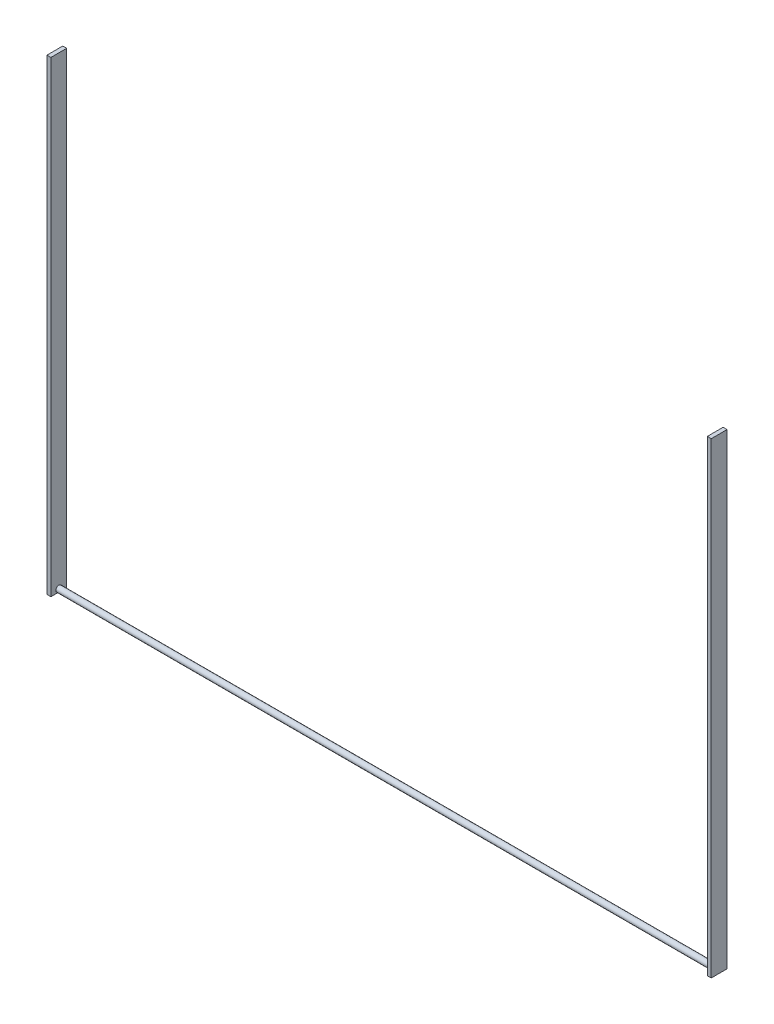
ISO-10303-21;
HEADER;
FILE_DESCRIPTION(('STEP AP214'),'2;1');
FILE_NAME('part.step','',(''),(''),'','','');
FILE_SCHEMA(('AUTOMOTIVE_DESIGN { 1 0 10303 214 1 1 1 1 }'));
ENDSEC;
DATA;
#1=APPLICATION_CONTEXT('core data for automotive mechanical design processes');
#2=APPLICATION_PROTOCOL_DEFINITION('international standard','automotive_design',2000,#1);
#3=PRODUCT_CONTEXT('',#1,'mechanical');
#4=PRODUCT('Part','Part','',(#3));
#5=PRODUCT_RELATED_PRODUCT_CATEGORY('part','',(#4));
#6=PRODUCT_DEFINITION_FORMATION('','',#4);
#7=PRODUCT_DEFINITION_CONTEXT('part definition',#1,'design');
#8=PRODUCT_DEFINITION('design','',#6,#7);
#9=PRODUCT_DEFINITION_SHAPE('','',#8);
#10=(LENGTH_UNIT() NAMED_UNIT(*) SI_UNIT(.MILLI.,.METRE.));
#11=(NAMED_UNIT(*) PLANE_ANGLE_UNIT() SI_UNIT($,.RADIAN.));
#12=(NAMED_UNIT(*) SI_UNIT($,.STERADIAN.) SOLID_ANGLE_UNIT());
#13=UNCERTAINTY_MEASURE_WITH_UNIT(LENGTH_MEASURE(1.E-05),#10,'distance_accuracy_value','');
#14=(GEOMETRIC_REPRESENTATION_CONTEXT(3) GLOBAL_UNCERTAINTY_ASSIGNED_CONTEXT((#13)) GLOBAL_UNIT_ASSIGNED_CONTEXT((#10,
#11,#12)) REPRESENTATION_CONTEXT('',''));
#15=CARTESIAN_POINT('',(0.,0.,0.));
#16=DIRECTION('',(0.,0.,1.));
#17=DIRECTION('',(1.,0.,0.));
#18=AXIS2_PLACEMENT_3D('',#15,#16,#17);
#19=CARTESIAN_POINT('',(6.35,0.,25.4));
#20=DIRECTION('',(0.,1.,0.));
#21=DIRECTION('',(0.,0.,1.));
#22=AXIS2_PLACEMENT_3D('',#19,#20,#21);
#23=PLANE('',#22);
#24=DIRECTION('',(1.,0.,0.));
#25=VECTOR('',#24,1.);
#26=CARTESIAN_POINT('',(6.35,0.,0.));
#27=LINE('',#26,#25);
#28=CARTESIAN_POINT('',(0.,0.,0.));
#29=VERTEX_POINT('',#28);
#30=CARTESIAN_POINT('',(6.35,0.,0.));
#31=VERTEX_POINT('',#30);
#32=EDGE_CURVE('E138',#29,#31,#27,.T.);
#33=ORIENTED_EDGE('',*,*,#32,.T.);
#34=DIRECTION('',(0.,0.,-1.));
#35=VECTOR('',#34,1.);
#36=CARTESIAN_POINT('',(6.35,0.,25.4));
#37=LINE('',#36,#35);
#38=CARTESIAN_POINT('',(6.35,0.,25.4));
#39=VERTEX_POINT('',#38);
#40=EDGE_CURVE('E43',#39,#31,#37,.T.);
#41=ORIENTED_EDGE('',*,*,#40,.F.);
#42=DIRECTION('',(1.,0.,0.));
#43=VECTOR('',#42,1.);
#44=CARTESIAN_POINT('',(6.35,0.,25.4));
#45=LINE('',#44,#43);
#46=CARTESIAN_POINT('',(0.,0.,25.4));
#47=VERTEX_POINT('',#46);
#48=EDGE_CURVE('E144',#47,#39,#45,.T.);
#49=ORIENTED_EDGE('',*,*,#48,.F.);
#50=DIRECTION('',(0.,0.,-1.));
#51=VECTOR('',#50,1.);
#52=CARTESIAN_POINT('',(0.,0.,25.4));
#53=LINE('',#52,#51);
#54=EDGE_CURVE('E150',#47,#29,#53,.T.);
#55=ORIENTED_EDGE('',*,*,#54,.T.);
#56=EDGE_LOOP('',(#33,#41,#49,#55));
#57=FACE_BOUND('',#56,.T.);
#58=ADVANCED_FACE('F35',(#57),#23,.F.);
#59=CARTESIAN_POINT('',(6.35,750.,25.4));
#60=DIRECTION('',(-1.,0.,0.));
#61=DIRECTION('',(0.,-1.,0.));
#62=AXIS2_PLACEMENT_3D('',#59,#60,#61);
#63=PLANE('',#62);
#64=CARTESIAN_POINT('',(6.35000000000008,5.,12.7));
#65=DIRECTION('',(-1.,0.,0.));
#66=DIRECTION('',(0.,-1.,0.));
#67=AXIS2_PLACEMENT_3D('',#64,#65,#66);
#68=CIRCLE('',#67,4.7625);
#69=CARTESIAN_POINT('',(6.35000000000008,0.237500000000001,12.7));
#70=VERTEX_POINT('',#69);
#71=EDGE_CURVE('E11',#70,#70,#68,.F.);
#72=ORIENTED_EDGE('',*,*,#71,.F.);
#73=EDGE_LOOP('',(#72));
#74=FACE_BOUND('',#73,.T.);
#75=DIRECTION('',(0.,1.,0.));
#76=VECTOR('',#75,1.);
#77=CARTESIAN_POINT('',(6.35,750.,0.));
#78=LINE('',#77,#76);
#79=CARTESIAN_POINT('',(6.35,750.,0.));
#80=VERTEX_POINT('',#79);
#81=EDGE_CURVE('E153',#31,#80,#78,.T.);
#82=ORIENTED_EDGE('',*,*,#81,.T.);
#83=DIRECTION('',(0.,0.,-1.));
#84=VECTOR('',#83,1.);
#85=CARTESIAN_POINT('',(6.35,750.,25.4));
#86=LINE('',#85,#84);
#87=CARTESIAN_POINT('',(6.35,750.,25.4));
#88=VERTEX_POINT('',#87);
#89=EDGE_CURVE('E160',#88,#80,#86,.T.);
#90=ORIENTED_EDGE('',*,*,#89,.F.);
#91=DIRECTION('',(0.,1.,0.));
#92=VECTOR('',#91,1.);
#93=CARTESIAN_POINT('',(6.35,750.,25.4));
#94=LINE('',#93,#92);
#95=EDGE_CURVE('E83',#39,#88,#94,.T.);
#96=ORIENTED_EDGE('',*,*,#95,.F.);
#97=ORIENTED_EDGE('',*,*,#40,.T.);
#98=EDGE_LOOP('',(#82,#90,#96,#97));
#99=FACE_BOUND('',#98,.T.);
#100=ADVANCED_FACE('F162',(#74,#99),#63,.F.);
#101=CARTESIAN_POINT('',(0.,750.,25.4));
#102=DIRECTION('',(0.,-1.,0.));
#103=DIRECTION('',(0.,0.,-1.));
#104=AXIS2_PLACEMENT_3D('',#101,#102,#103);
#105=PLANE('',#104);
#106=DIRECTION('',(-1.,0.,0.));
#107=VECTOR('',#106,1.);
#108=CARTESIAN_POINT('',(0.,750.,0.));
#109=LINE('',#108,#107);
#110=CARTESIAN_POINT('',(0.,750.,0.));
#111=VERTEX_POINT('',#110);
#112=EDGE_CURVE('E69',#80,#111,#109,.T.);
#113=ORIENTED_EDGE('',*,*,#112,.T.);
#114=DIRECTION('',(0.,0.,-1.));
#115=VECTOR('',#114,1.);
#116=CARTESIAN_POINT('',(0.,750.,25.4));
#117=LINE('',#116,#115);
#118=CARTESIAN_POINT('',(0.,750.,25.4));
#119=VERTEX_POINT('',#118);
#120=EDGE_CURVE('E158',#119,#111,#117,.T.);
#121=ORIENTED_EDGE('',*,*,#120,.F.);
#122=DIRECTION('',(-1.,0.,0.));
#123=VECTOR('',#122,1.);
#124=CARTESIAN_POINT('',(0.,750.,25.4));
#125=LINE('',#124,#123);
#126=EDGE_CURVE('E147',#88,#119,#125,.T.);
#127=ORIENTED_EDGE('',*,*,#126,.F.);
#128=ORIENTED_EDGE('',*,*,#89,.T.);
#129=EDGE_LOOP('',(#113,#121,#127,#128));
#130=FACE_BOUND('',#129,.T.);
#131=ADVANCED_FACE('F185',(#130),#105,.F.);
#132=CARTESIAN_POINT('',(0.,0.,25.4));
#133=DIRECTION('',(1.,0.,0.));
#134=DIRECTION('',(0.,0.,-1.));
#135=AXIS2_PLACEMENT_3D('',#132,#133,#134);
#136=PLANE('',#135);
#137=DIRECTION('',(0.,-1.,0.));
#138=VECTOR('',#137,1.);
#139=CARTESIAN_POINT('',(0.,0.,0.));
#140=LINE('',#139,#138);
#141=EDGE_CURVE('E75',#111,#29,#140,.T.);
#142=ORIENTED_EDGE('',*,*,#141,.T.);
#143=ORIENTED_EDGE('',*,*,#54,.F.);
#144=DIRECTION('',(0.,-1.,0.));
#145=VECTOR('',#144,1.);
#146=CARTESIAN_POINT('',(0.,0.,25.4));
#147=LINE('',#146,#145);
#148=EDGE_CURVE('E51',#119,#47,#147,.T.);
#149=ORIENTED_EDGE('',*,*,#148,.F.);
#150=ORIENTED_EDGE('',*,*,#120,.T.);
#151=EDGE_LOOP('',(#142,#143,#149,#150));
#152=FACE_BOUND('',#151,.T.);
#153=ADVANCED_FACE('F178',(#152),#136,.F.);
#154=CARTESIAN_POINT('',(0.,0.,25.4));
#155=DIRECTION('',(0.,0.,-1.));
#156=DIRECTION('',(-1.,0.,0.));
#157=AXIS2_PLACEMENT_3D('',#154,#155,#156);
#158=PLANE('',#157);
#159=ORIENTED_EDGE('',*,*,#48,.T.);
#160=ORIENTED_EDGE('',*,*,#95,.T.);
#161=ORIENTED_EDGE('',*,*,#126,.T.);
#162=ORIENTED_EDGE('',*,*,#148,.T.);
#163=EDGE_LOOP('',(#159,#160,#161,#162));
#164=FACE_BOUND('',#163,.T.);
#165=ADVANCED_FACE('F170',(#164),#158,.F.);
#166=CARTESIAN_POINT('',(0.,0.,0.));
#167=DIRECTION('',(0.,0.,-1.));
#168=DIRECTION('',(-1.,0.,0.));
#169=AXIS2_PLACEMENT_3D('',#166,#167,#168);
#170=PLANE('',#169);
#171=ORIENTED_EDGE('',*,*,#32,.F.);
#172=ORIENTED_EDGE('',*,*,#141,.F.);
#173=ORIENTED_EDGE('',*,*,#112,.F.);
#174=ORIENTED_EDGE('',*,*,#81,.F.);
#175=EDGE_LOOP('',(#171,#172,#173,#174));
#176=FACE_BOUND('',#175,.T.);
#177=ADVANCED_FACE('F167',(#176),#170,.T.);
#178=CARTESIAN_POINT('',(1073.8203841816,5.00000000000012,12.7));
#179=DIRECTION('',(-1.,0.,0.));
#180=DIRECTION('',(0.,-1.,0.));
#181=AXIS2_PLACEMENT_3D('',#178,#179,#180);
#182=CYLINDRICAL_SURFACE('',#181,4.7625);
#183=ORIENTED_EDGE('',*,*,#71,.T.);
#184=EDGE_LOOP('',(#183));
#185=FACE_BOUND('',#184,.T.);
#186=CARTESIAN_POINT('',(1060.35,5.00000000000012,12.7));
#187=DIRECTION('',(1.,0.,0.));
#188=DIRECTION('',(0.,1.,0.));
#189=AXIS2_PLACEMENT_3D('',#186,#187,#188);
#190=CIRCLE('',#189,4.7625);
#191=CARTESIAN_POINT('',(1060.35,9.76250000000012,12.7));
#192=VERTEX_POINT('',#191);
#193=EDGE_CURVE('E135',#192,#192,#190,.T.);
#194=ORIENTED_EDGE('',*,*,#193,.F.);
#195=EDGE_LOOP('',(#194));
#196=FACE_BOUND('',#195,.T.);
#197=ADVANCED_FACE('F169',(#185,#196),#182,.T.);
#198=CARTESIAN_POINT('',(1060.35,750.,25.4));
#199=DIRECTION('',(1.,0.,0.));
#200=DIRECTION('',(0.,1.,0.));
#201=AXIS2_PLACEMENT_3D('',#198,#199,#200);
#202=PLANE('',#201);
#203=ORIENTED_EDGE('',*,*,#193,.T.);
#204=EDGE_LOOP('',(#203));
#205=FACE_BOUND('',#204,.T.);
#206=DIRECTION('',(0.,-1.,0.));
#207=VECTOR('',#206,1.);
#208=CARTESIAN_POINT('',(1060.35,750.,0.));
#209=LINE('',#208,#207);
#210=CARTESIAN_POINT('',(1060.35,750.,0.));
#211=VERTEX_POINT('',#210);
#212=CARTESIAN_POINT('',(1060.35,0.,0.));
#213=VERTEX_POINT('',#212);
#214=EDGE_CURVE('E134',#211,#213,#209,.T.);
#215=ORIENTED_EDGE('',*,*,#214,.T.);
#216=DIRECTION('',(0.,0.,-1.));
#217=VECTOR('',#216,1.);
#218=CARTESIAN_POINT('',(1060.35,0.,25.4));
#219=LINE('',#218,#217);
#220=CARTESIAN_POINT('',(1060.35,0.,25.4));
#221=VERTEX_POINT('',#220);
#222=EDGE_CURVE('E114',#221,#213,#219,.T.);
#223=ORIENTED_EDGE('',*,*,#222,.F.);
#224=DIRECTION('',(0.,-1.,0.));
#225=VECTOR('',#224,1.);
#226=CARTESIAN_POINT('',(1060.35,750.,25.4));
#227=LINE('',#226,#225);
#228=CARTESIAN_POINT('',(1060.35,750.,25.4));
#229=VERTEX_POINT('',#228);
#230=EDGE_CURVE('E121',#229,#221,#227,.T.);
#231=ORIENTED_EDGE('',*,*,#230,.F.);
#232=DIRECTION('',(0.,0.,-1.));
#233=VECTOR('',#232,1.);
#234=CARTESIAN_POINT('',(1060.35,750.,25.4));
#235=LINE('',#234,#233);
#236=EDGE_CURVE('E287',#229,#211,#235,.T.);
#237=ORIENTED_EDGE('',*,*,#236,.T.);
#238=EDGE_LOOP('',(#215,#223,#231,#237));
#239=FACE_BOUND('',#238,.T.);
#240=ADVANCED_FACE('F132',(#205,#239),#202,.F.);
#241=CARTESIAN_POINT('',(1060.35,0.,25.4));
#242=DIRECTION('',(0.,1.,0.));
#243=DIRECTION('',(0.,0.,1.));
#244=AXIS2_PLACEMENT_3D('',#241,#242,#243);
#245=PLANE('',#244);
#246=DIRECTION('',(1.,0.,0.));
#247=VECTOR('',#246,1.);
#248=CARTESIAN_POINT('',(1060.35,0.,0.));
#249=LINE('',#248,#247);
#250=CARTESIAN_POINT('',(1066.7,0.,0.));
#251=VERTEX_POINT('',#250);
#252=EDGE_CURVE('E278',#213,#251,#249,.T.);
#253=ORIENTED_EDGE('',*,*,#252,.T.);
#254=DIRECTION('',(0.,0.,-1.));
#255=VECTOR('',#254,1.);
#256=CARTESIAN_POINT('',(1066.7,0.,25.4));
#257=LINE('',#256,#255);
#258=CARTESIAN_POINT('',(1066.7,0.,25.4));
#259=VERTEX_POINT('',#258);
#260=EDGE_CURVE('E117',#259,#251,#257,.T.);
#261=ORIENTED_EDGE('',*,*,#260,.F.);
#262=DIRECTION('',(1.,0.,0.));
#263=VECTOR('',#262,1.);
#264=CARTESIAN_POINT('',(1060.35,0.,25.4));
#265=LINE('',#264,#263);
#266=EDGE_CURVE('E110',#221,#259,#265,.T.);
#267=ORIENTED_EDGE('',*,*,#266,.F.);
#268=ORIENTED_EDGE('',*,*,#222,.T.);
#269=EDGE_LOOP('',(#253,#261,#267,#268));
#270=FACE_BOUND('',#269,.T.);
#271=ADVANCED_FACE('F112',(#270),#245,.F.);
#272=CARTESIAN_POINT('',(1066.7,0.,25.4));
#273=DIRECTION('',(-1.,0.,0.));
#274=DIRECTION('',(0.,0.,1.));
#275=AXIS2_PLACEMENT_3D('',#272,#273,#274);
#276=PLANE('',#275);
#277=DIRECTION('',(0.,1.,0.));
#278=VECTOR('',#277,1.);
#279=CARTESIAN_POINT('',(1066.7,0.,0.));
#280=LINE('',#279,#278);
#281=CARTESIAN_POINT('',(1066.7,750.,0.));
#282=VERTEX_POINT('',#281);
#283=EDGE_CURVE('E280',#251,#282,#280,.T.);
#284=ORIENTED_EDGE('',*,*,#283,.T.);
#285=DIRECTION('',(0.,0.,-1.));
#286=VECTOR('',#285,1.);
#287=CARTESIAN_POINT('',(1066.7,750.,25.4));
#288=LINE('',#287,#286);
#289=CARTESIAN_POINT('',(1066.7,750.,25.4));
#290=VERTEX_POINT('',#289);
#291=EDGE_CURVE('E140',#290,#282,#288,.T.);
#292=ORIENTED_EDGE('',*,*,#291,.F.);
#293=DIRECTION('',(0.,1.,0.));
#294=VECTOR('',#293,1.);
#295=CARTESIAN_POINT('',(1066.7,0.,25.4));
#296=LINE('',#295,#294);
#297=EDGE_CURVE('E120',#259,#290,#296,.T.);
#298=ORIENTED_EDGE('',*,*,#297,.F.);
#299=ORIENTED_EDGE('',*,*,#260,.T.);
#300=EDGE_LOOP('',(#284,#292,#298,#299));
#301=FACE_BOUND('',#300,.T.);
#302=ADVANCED_FACE('F236',(#301),#276,.F.);
#303=CARTESIAN_POINT('',(1066.7,750.,25.4));
#304=DIRECTION('',(0.,-1.,0.));
#305=DIRECTION('',(0.,0.,-1.));
#306=AXIS2_PLACEMENT_3D('',#303,#304,#305);
#307=PLANE('',#306);
#308=DIRECTION('',(-1.,0.,0.));
#309=VECTOR('',#308,1.);
#310=CARTESIAN_POINT('',(1066.7,750.,0.));
#311=LINE('',#310,#309);
#312=EDGE_CURVE('E130',#282,#211,#311,.T.);
#313=ORIENTED_EDGE('',*,*,#312,.T.);
#314=ORIENTED_EDGE('',*,*,#236,.F.);
#315=DIRECTION('',(-1.,0.,0.));
#316=VECTOR('',#315,1.);
#317=CARTESIAN_POINT('',(1066.7,750.,25.4));
#318=LINE('',#317,#316);
#319=EDGE_CURVE('E126',#290,#229,#318,.T.);
#320=ORIENTED_EDGE('',*,*,#319,.F.);
#321=ORIENTED_EDGE('',*,*,#291,.T.);
#322=EDGE_LOOP('',(#313,#314,#320,#321));
#323=FACE_BOUND('',#322,.T.);
#324=ADVANCED_FACE('F245',(#323),#307,.F.);
#325=CARTESIAN_POINT('',(0.,0.,25.4));
#326=DIRECTION('',(0.,0.,1.));
#327=DIRECTION('',(1.,0.,0.));
#328=AXIS2_PLACEMENT_3D('',#325,#326,#327);
#329=PLANE('',#328);
#330=ORIENTED_EDGE('',*,*,#230,.T.);
#331=ORIENTED_EDGE('',*,*,#266,.T.);
#332=ORIENTED_EDGE('',*,*,#297,.T.);
#333=ORIENTED_EDGE('',*,*,#319,.T.);
#334=EDGE_LOOP('',(#330,#331,#332,#333));
#335=FACE_BOUND('',#334,.T.);
#336=ADVANCED_FACE('F124',(#335),#329,.T.);
#337=CARTESIAN_POINT('',(0.,0.,0.));
#338=DIRECTION('',(0.,0.,1.));
#339=DIRECTION('',(1.,0.,0.));
#340=AXIS2_PLACEMENT_3D('',#337,#338,#339);
#341=PLANE('',#340);
#342=ORIENTED_EDGE('',*,*,#214,.F.);
#343=ORIENTED_EDGE('',*,*,#312,.F.);
#344=ORIENTED_EDGE('',*,*,#283,.F.);
#345=ORIENTED_EDGE('',*,*,#252,.F.);
#346=EDGE_LOOP('',(#342,#343,#344,#345));
#347=FACE_BOUND('',#346,.T.);
#348=ADVANCED_FACE('F264',(#347),#341,.F.);
#349=CLOSED_SHELL('',(#58,#100,#131,#153,#165,#177,#197,#240,#271,#302,#324,#336,#348));
#350=MANIFOLD_SOLID_BREP('B2',#349);
#351=ADVANCED_BREP_SHAPE_REPRESENTATION('',(#18,#350),#14);
#352=SHAPE_DEFINITION_REPRESENTATION(#9,#351);
ENDSEC;
END-ISO-10303-21;
